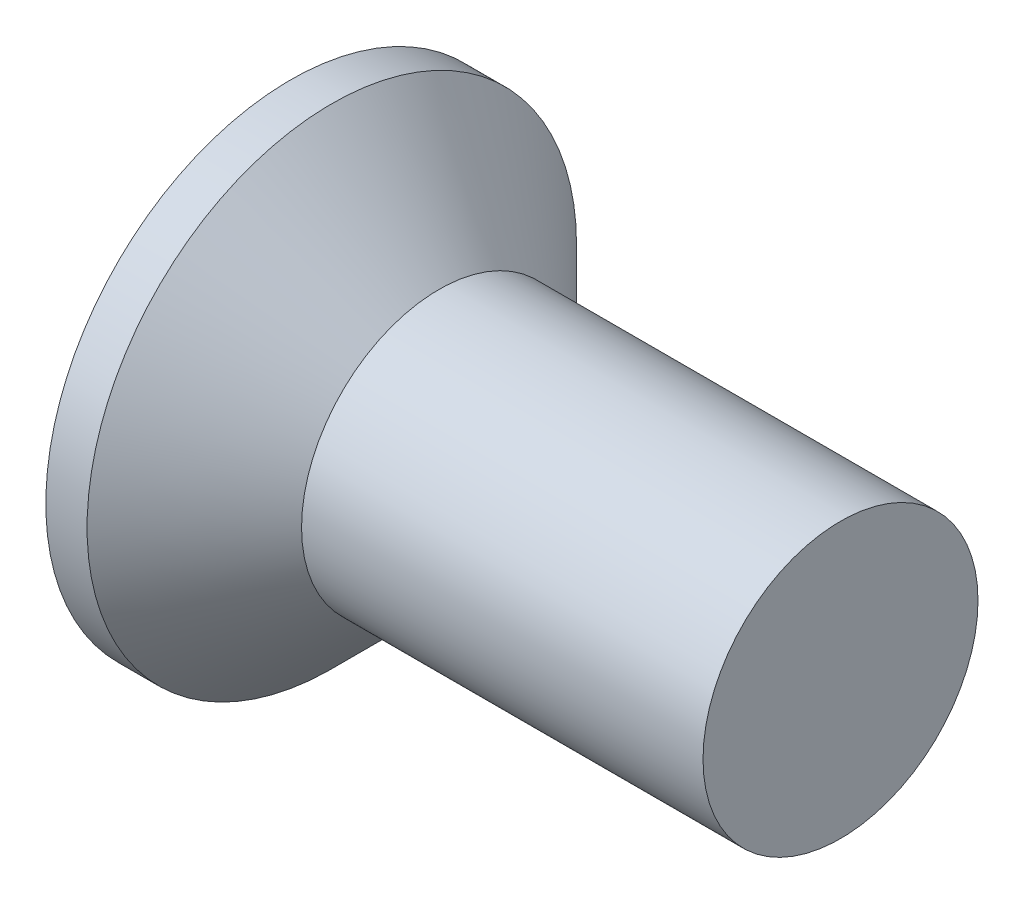
ISO-10303-21;
HEADER;
FILE_DESCRIPTION(('STEP AP214'),'2;1');
FILE_NAME('part.step','',(''),(''),'','','');
FILE_SCHEMA(('AUTOMOTIVE_DESIGN { 1 0 10303 214 1 1 1 1 }'));
ENDSEC;
DATA;
#1=APPLICATION_CONTEXT('core data for automotive mechanical design processes');
#2=APPLICATION_PROTOCOL_DEFINITION('international standard','automotive_design',2000,#1);
#3=PRODUCT_CONTEXT('',#1,'mechanical');
#4=PRODUCT('Part','Part','',(#3));
#5=PRODUCT_RELATED_PRODUCT_CATEGORY('part','',(#4));
#6=PRODUCT_DEFINITION_FORMATION('','',#4);
#7=PRODUCT_DEFINITION_CONTEXT('part definition',#1,'design');
#8=PRODUCT_DEFINITION('design','',#6,#7);
#9=PRODUCT_DEFINITION_SHAPE('','',#8);
#10=(LENGTH_UNIT() NAMED_UNIT(*) SI_UNIT(.MILLI.,.METRE.));
#11=(NAMED_UNIT(*) PLANE_ANGLE_UNIT() SI_UNIT($,.RADIAN.));
#12=(NAMED_UNIT(*) SI_UNIT($,.STERADIAN.) SOLID_ANGLE_UNIT());
#13=UNCERTAINTY_MEASURE_WITH_UNIT(LENGTH_MEASURE(1.E-05),#10,'distance_accuracy_value','');
#14=(GEOMETRIC_REPRESENTATION_CONTEXT(3) GLOBAL_UNCERTAINTY_ASSIGNED_CONTEXT((#13)) GLOBAL_UNIT_ASSIGNED_CONTEXT((#10,
#11,#12)) REPRESENTATION_CONTEXT('',''));
#15=CARTESIAN_POINT('',(0.,0.,0.));
#16=DIRECTION('',(0.,0.,1.));
#17=DIRECTION('',(1.,0.,0.));
#18=AXIS2_PLACEMENT_3D('',#15,#16,#17);
#19=CARTESIAN_POINT('',(0.,4.44999999999999,0.));
#20=DIRECTION('',(-1.,0.,0.));
#21=DIRECTION('',(0.,0.,1.));
#22=AXIS2_PLACEMENT_3D('',#19,#20,#21);
#23=PLANE('',#22);
#24=CARTESIAN_POINT('',(0.,0.,0.));
#25=DIRECTION('',(1.,0.,0.));
#26=DIRECTION('',(0.,0.,-1.));
#27=AXIS2_PLACEMENT_3D('',#24,#25,#26);
#28=CIRCLE('',#27,4.44999999999999);
#29=CARTESIAN_POINT('',(0.,0.,-4.44999999999999));
#30=VERTEX_POINT('',#29);
#31=EDGE_CURVE('E180',#30,#30,#28,.T.);
#32=ORIENTED_EDGE('',*,*,#31,.F.);
#33=EDGE_LOOP('',(#32));
#34=FACE_BOUND('',#33,.T.);
#35=DIRECTION('',(0.,1.,0.));
#36=VECTOR('',#35,1.);
#37=CARTESIAN_POINT('',(0.,-0.52,-0.52));
#38=LINE('',#37,#36);
#39=CARTESIAN_POINT('',(0.,-2.6,-0.52));
#40=VERTEX_POINT('',#39);
#41=CARTESIAN_POINT('',(0.,-0.82,-0.52));
#42=VERTEX_POINT('',#41);
#43=EDGE_CURVE('E284',#40,#42,#38,.T.);
#44=ORIENTED_EDGE('',*,*,#43,.T.);
#45=CARTESIAN_POINT('',(0.,-0.82,-0.82));
#46=DIRECTION('',(-1.,0.,0.));
#47=DIRECTION('',(0.,0.,1.));
#48=AXIS2_PLACEMENT_3D('',#45,#46,#47);
#49=CIRCLE('',#48,0.3);
#50=CARTESIAN_POINT('',(0.,-0.52,-0.82));
#51=VERTEX_POINT('',#50);
#52=EDGE_CURVE('E186',#42,#51,#49,.T.);
#53=ORIENTED_EDGE('',*,*,#52,.T.);
#54=DIRECTION('',(0.,0.,-1.));
#55=VECTOR('',#54,1.);
#56=CARTESIAN_POINT('',(0.,-0.52,-0.52));
#57=LINE('',#56,#55);
#58=CARTESIAN_POINT('',(0.,-0.52,-2.6));
#59=VERTEX_POINT('',#58);
#60=EDGE_CURVE('E279',#51,#59,#57,.T.);
#61=ORIENTED_EDGE('',*,*,#60,.T.);
#62=DIRECTION('',(0.,1.,0.));
#63=VECTOR('',#62,1.);
#64=CARTESIAN_POINT('',(0.,0.52,-2.6));
#65=LINE('',#64,#63);
#66=CARTESIAN_POINT('',(0.,0.52,-2.6));
#67=VERTEX_POINT('',#66);
#68=EDGE_CURVE('E243',#59,#67,#65,.T.);
#69=ORIENTED_EDGE('',*,*,#68,.T.);
#70=DIRECTION('',(0.,0.,1.));
#71=VECTOR('',#70,1.);
#72=CARTESIAN_POINT('',(0.,0.52,-0.52));
#73=LINE('',#72,#71);
#74=CARTESIAN_POINT('',(0.,0.52,-0.82));
#75=VERTEX_POINT('',#74);
#76=EDGE_CURVE('E233',#67,#75,#73,.T.);
#77=ORIENTED_EDGE('',*,*,#76,.T.);
#78=CARTESIAN_POINT('',(0.,0.82,-0.82));
#79=DIRECTION('',(-1.,0.,0.));
#80=DIRECTION('',(0.,0.,1.));
#81=AXIS2_PLACEMENT_3D('',#78,#79,#80);
#82=CIRCLE('',#81,0.3);
#83=CARTESIAN_POINT('',(0.,0.82,-0.52));
#84=VERTEX_POINT('',#83);
#85=EDGE_CURVE('E182',#75,#84,#82,.T.);
#86=ORIENTED_EDGE('',*,*,#85,.T.);
#87=DIRECTION('',(0.,1.,0.));
#88=VECTOR('',#87,1.);
#89=CARTESIAN_POINT('',(0.,0.52,-0.52));
#90=LINE('',#89,#88);
#91=CARTESIAN_POINT('',(0.,2.6,-0.52));
#92=VERTEX_POINT('',#91);
#93=EDGE_CURVE('E230',#84,#92,#90,.T.);
#94=ORIENTED_EDGE('',*,*,#93,.T.);
#95=DIRECTION('',(0.,0.,1.));
#96=VECTOR('',#95,1.);
#97=CARTESIAN_POINT('',(0.,2.6,-0.52));
#98=LINE('',#97,#96);
#99=CARTESIAN_POINT('',(0.,2.6,0.52));
#100=VERTEX_POINT('',#99);
#101=EDGE_CURVE('E239',#92,#100,#98,.T.);
#102=ORIENTED_EDGE('',*,*,#101,.T.);
#103=DIRECTION('',(0.,-1.,0.));
#104=VECTOR('',#103,1.);
#105=CARTESIAN_POINT('',(0.,0.52,0.52));
#106=LINE('',#105,#104);
#107=CARTESIAN_POINT('',(0.,0.82,0.52));
#108=VERTEX_POINT('',#107);
#109=EDGE_CURVE('E241',#100,#108,#106,.T.);
#110=ORIENTED_EDGE('',*,*,#109,.T.);
#111=CARTESIAN_POINT('',(0.,0.82,0.82));
#112=DIRECTION('',(-1.,0.,0.));
#113=DIRECTION('',(0.,0.,1.));
#114=AXIS2_PLACEMENT_3D('',#111,#112,#113);
#115=CIRCLE('',#114,0.3);
#116=CARTESIAN_POINT('',(0.,0.52,0.82));
#117=VERTEX_POINT('',#116);
#118=EDGE_CURVE('E152',#108,#117,#115,.T.);
#119=ORIENTED_EDGE('',*,*,#118,.T.);
#120=DIRECTION('',(0.,0.,1.));
#121=VECTOR('',#120,1.);
#122=CARTESIAN_POINT('',(0.,0.52,0.52));
#123=LINE('',#122,#121);
#124=CARTESIAN_POINT('',(0.,0.519999999999999,2.6));
#125=VERTEX_POINT('',#124);
#126=EDGE_CURVE('E146',#117,#125,#123,.T.);
#127=ORIENTED_EDGE('',*,*,#126,.T.);
#128=DIRECTION('',(0.,-1.,0.));
#129=VECTOR('',#128,1.);
#130=CARTESIAN_POINT('',(0.,0.519999999999999,2.6));
#131=LINE('',#130,#129);
#132=CARTESIAN_POINT('',(0.,-0.520000000000001,2.6));
#133=VERTEX_POINT('',#132);
#134=EDGE_CURVE('E150',#125,#133,#131,.T.);
#135=ORIENTED_EDGE('',*,*,#134,.T.);
#136=DIRECTION('',(0.,0.,-1.));
#137=VECTOR('',#136,1.);
#138=CARTESIAN_POINT('',(0.,-0.52,0.519999999999999));
#139=LINE('',#138,#137);
#140=CARTESIAN_POINT('',(0.,-0.52,0.819999999999999));
#141=VERTEX_POINT('',#140);
#142=EDGE_CURVE('E162',#133,#141,#139,.T.);
#143=ORIENTED_EDGE('',*,*,#142,.T.);
#144=CARTESIAN_POINT('',(0.,-0.82,0.819999999999999));
#145=DIRECTION('',(-1.,0.,0.));
#146=DIRECTION('',(0.,0.,1.));
#147=AXIS2_PLACEMENT_3D('',#144,#145,#146);
#148=CIRCLE('',#147,0.3);
#149=CARTESIAN_POINT('',(0.,-0.82,0.519999999999999));
#150=VERTEX_POINT('',#149);
#151=EDGE_CURVE('E184',#141,#150,#148,.T.);
#152=ORIENTED_EDGE('',*,*,#151,.T.);
#153=DIRECTION('',(0.,-1.,0.));
#154=VECTOR('',#153,1.);
#155=CARTESIAN_POINT('',(0.,-0.52,0.519999999999999));
#156=LINE('',#155,#154);
#157=CARTESIAN_POINT('',(0.,-2.6,0.519999999999999));
#158=VERTEX_POINT('',#157);
#159=EDGE_CURVE('E291',#150,#158,#156,.T.);
#160=ORIENTED_EDGE('',*,*,#159,.T.);
#161=DIRECTION('',(0.,0.,-1.));
#162=VECTOR('',#161,1.);
#163=CARTESIAN_POINT('',(0.,-2.6,-0.52));
#164=LINE('',#163,#162);
#165=EDGE_CURVE('E288',#158,#40,#164,.T.);
#166=ORIENTED_EDGE('',*,*,#165,.T.);
#167=EDGE_LOOP('',(#44,#53,#61,#69,#77,#86,#94,#102,#110,#119,#127,#135,#143,#152,#160,#166));
#168=FACE_BOUND('',#167,.T.);
#169=ADVANCED_FACE('F34',(#34,#168),#23,.T.);
#170=CARTESIAN_POINT('',(10.,2.49999999999999,0.));
#171=DIRECTION('',(1.,0.,0.));
#172=DIRECTION('',(0.,0.,-1.));
#173=AXIS2_PLACEMENT_3D('',#170,#171,#172);
#174=PLANE('',#173);
#175=CARTESIAN_POINT('',(9.99999999999999,0.,0.));
#176=DIRECTION('',(1.,0.,0.));
#177=DIRECTION('',(0.,0.,-1.));
#178=AXIS2_PLACEMENT_3D('',#175,#176,#177);
#179=CIRCLE('',#178,2.49999999999999);
#180=CARTESIAN_POINT('',(9.99999999999999,0.,-2.49999999999999));
#181=VERTEX_POINT('',#180);
#182=EDGE_CURVE('E167',#181,#181,#179,.T.);
#183=ORIENTED_EDGE('',*,*,#182,.T.);
#184=EDGE_LOOP('',(#183));
#185=FACE_BOUND('',#184,.T.);
#186=ADVANCED_FACE('F340',(#185),#174,.T.);
#187=CARTESIAN_POINT('',(4.51581291088132,0.,0.));
#188=DIRECTION('',(1.,0.,0.));
#189=DIRECTION('',(0.,0.,-1.));
#190=AXIS2_PLACEMENT_3D('',#187,#188,#189);
#191=CYLINDRICAL_SURFACE('',#190,4.44999999999999);
#192=ORIENTED_EDGE('',*,*,#31,.T.);
#193=EDGE_LOOP('',(#192));
#194=FACE_BOUND('',#193,.T.);
#195=CARTESIAN_POINT('',(0.750000000000007,0.,0.));
#196=DIRECTION('',(1.,0.,0.));
#197=DIRECTION('',(0.,0.,-1.));
#198=AXIS2_PLACEMENT_3D('',#195,#196,#197);
#199=CIRCLE('',#198,4.44999999999999);
#200=CARTESIAN_POINT('',(0.750000000000007,0.,-4.44999999999999));
#201=VERTEX_POINT('',#200);
#202=EDGE_CURVE('E250',#201,#201,#199,.T.);
#203=ORIENTED_EDGE('',*,*,#202,.F.);
#204=EDGE_LOOP('',(#203));
#205=FACE_BOUND('',#204,.T.);
#206=ADVANCED_FACE('F346',(#194,#205),#191,.T.);
#207=CARTESIAN_POINT('',(2.7,0.,0.));
#208=DIRECTION('',(-1.,0.,0.));
#209=DIRECTION('',(0.,0.,1.));
#210=AXIS2_PLACEMENT_3D('',#207,#208,#209);
#211=CONICAL_SURFACE('',#210,2.49999999999999,0.78539816339745);
#212=ORIENTED_EDGE('',*,*,#202,.T.);
#213=EDGE_LOOP('',(#212));
#214=FACE_BOUND('',#213,.T.);
#215=CARTESIAN_POINT('',(2.7,0.,0.));
#216=DIRECTION('',(1.,0.,0.));
#217=DIRECTION('',(0.,0.,-1.));
#218=AXIS2_PLACEMENT_3D('',#215,#216,#217);
#219=CIRCLE('',#218,2.49999999999999);
#220=CARTESIAN_POINT('',(2.7,0.,-2.49999999999999));
#221=VERTEX_POINT('',#220);
#222=EDGE_CURVE('E170',#221,#221,#219,.T.);
#223=ORIENTED_EDGE('',*,*,#222,.F.);
#224=EDGE_LOOP('',(#223));
#225=FACE_BOUND('',#224,.T.);
#226=ADVANCED_FACE('F486',(#214,#225),#211,.T.);
#227=CARTESIAN_POINT('',(4.51581291088132,0.,0.));
#228=DIRECTION('',(1.,0.,0.));
#229=DIRECTION('',(0.,0.,-1.));
#230=AXIS2_PLACEMENT_3D('',#227,#228,#229);
#231=CYLINDRICAL_SURFACE('',#230,2.49999999999999);
#232=ORIENTED_EDGE('',*,*,#182,.F.);
#233=EDGE_LOOP('',(#232));
#234=FACE_BOUND('',#233,.T.);
#235=ORIENTED_EDGE('',*,*,#222,.T.);
#236=EDGE_LOOP('',(#235));
#237=FACE_BOUND('',#236,.T.);
#238=ADVANCED_FACE('F456',(#234,#237),#231,.T.);
#239=CARTESIAN_POINT('',(1.35,0.52,0.52));
#240=DIRECTION('',(0.,-1.,0.));
#241=DIRECTION('',(0.,0.,-1.));
#242=AXIS2_PLACEMENT_3D('',#239,#240,#241);
#243=PLANE('',#242);
#244=ORIENTED_EDGE('',*,*,#126,.F.);
#245=DIRECTION('',(-1.,0.,0.));
#246=VECTOR('',#245,1.);
#247=CARTESIAN_POINT('',(1.35,0.52,0.82));
#248=LINE('',#247,#246);
#249=CARTESIAN_POINT('',(1.35,0.52,0.82));
#250=VERTEX_POINT('',#249);
#251=EDGE_CURVE('E49',#117,#250,#248,.F.);
#252=ORIENTED_EDGE('',*,*,#251,.T.);
#253=DIRECTION('',(0.,0.,1.));
#254=VECTOR('',#253,1.);
#255=CARTESIAN_POINT('',(1.35,0.52,0.52));
#256=LINE('',#255,#254);
#257=CARTESIAN_POINT('',(1.35,0.52,1.820577136594));
#258=VERTEX_POINT('',#257);
#259=EDGE_CURVE('E165',#250,#258,#256,.T.);
#260=ORIENTED_EDGE('',*,*,#259,.T.);
#261=DIRECTION('',(-0.866025403784438,0.,0.500000000000001));
#262=VECTOR('',#261,1.);
#263=CARTESIAN_POINT('',(0.,0.519999999999999,2.6));
#264=LINE('',#263,#262);
#265=EDGE_CURVE('E158',#258,#125,#264,.T.);
#266=ORIENTED_EDGE('',*,*,#265,.T.);
#267=EDGE_LOOP('',(#244,#252,#260,#266));
#268=FACE_BOUND('',#267,.T.);
#269=ADVANCED_FACE('F164',(#268),#243,.T.);
#270=CARTESIAN_POINT('',(0.,0.519999999999999,2.6));
#271=DIRECTION('',(-0.500000000000001,0.,-0.866025403784438));
#272=DIRECTION('',(-0.866025403784438,0.,0.500000000000001));
#273=AXIS2_PLACEMENT_3D('',#270,#271,#272);
#274=PLANE('',#273);
#275=ORIENTED_EDGE('',*,*,#134,.F.);
#276=ORIENTED_EDGE('',*,*,#265,.F.);
#277=DIRECTION('',(0.,-1.,0.));
#278=VECTOR('',#277,1.);
#279=CARTESIAN_POINT('',(1.35,0.52,1.820577136594));
#280=LINE('',#279,#278);
#281=CARTESIAN_POINT('',(1.35,-0.52,1.820577136594));
#282=VERTEX_POINT('',#281);
#283=EDGE_CURVE('E176',#258,#282,#280,.T.);
#284=ORIENTED_EDGE('',*,*,#283,.T.);
#285=DIRECTION('',(-0.866025403784438,0.,0.500000000000001));
#286=VECTOR('',#285,1.);
#287=CARTESIAN_POINT('',(1.91316641993582,-0.52,1.4954328524455));
#288=LINE('',#287,#286);
#289=EDGE_CURVE('E160',#282,#133,#288,.T.);
#290=ORIENTED_EDGE('',*,*,#289,.T.);
#291=EDGE_LOOP('',(#275,#276,#284,#290));
#292=FACE_BOUND('',#291,.T.);
#293=ADVANCED_FACE('F157',(#292),#274,.T.);
#294=CARTESIAN_POINT('',(1.35,-0.52,0.519999999999999));
#295=DIRECTION('',(0.,1.,0.));
#296=DIRECTION('',(0.,0.,1.));
#297=AXIS2_PLACEMENT_3D('',#294,#295,#296);
#298=PLANE('',#297);
#299=DIRECTION('',(0.,0.,-1.));
#300=VECTOR('',#299,1.);
#301=CARTESIAN_POINT('',(1.35,-0.52,0.519999999999999));
#302=LINE('',#301,#300);
#303=CARTESIAN_POINT('',(1.35,-0.52,0.819999999999999));
#304=VERTEX_POINT('',#303);
#305=EDGE_CURVE('E300',#282,#304,#302,.T.);
#306=ORIENTED_EDGE('',*,*,#305,.T.);
#307=DIRECTION('',(-1.,0.,0.));
#308=VECTOR('',#307,1.);
#309=CARTESIAN_POINT('',(1.35,-0.52,0.819999999999999));
#310=LINE('',#309,#308);
#311=EDGE_CURVE('E190',#304,#141,#310,.T.);
#312=ORIENTED_EDGE('',*,*,#311,.T.);
#313=ORIENTED_EDGE('',*,*,#142,.F.);
#314=ORIENTED_EDGE('',*,*,#289,.F.);
#315=EDGE_LOOP('',(#306,#312,#313,#314));
#316=FACE_BOUND('',#315,.T.);
#317=ADVANCED_FACE('F305',(#316),#298,.T.);
#318=CARTESIAN_POINT('',(1.35,-0.52,0.519999999999999));
#319=DIRECTION('',(0.,0.,-1.));
#320=DIRECTION('',(0.,1.,0.));
#321=AXIS2_PLACEMENT_3D('',#318,#319,#320);
#322=PLANE('',#321);
#323=ORIENTED_EDGE('',*,*,#159,.F.);
#324=DIRECTION('',(-1.,0.,0.));
#325=VECTOR('',#324,1.);
#326=CARTESIAN_POINT('',(1.35,-0.82,0.519999999999999));
#327=LINE('',#326,#325);
#328=CARTESIAN_POINT('',(1.35,-0.82,0.519999999999999));
#329=VERTEX_POINT('',#328);
#330=EDGE_CURVE('E193',#150,#329,#327,.F.);
#331=ORIENTED_EDGE('',*,*,#330,.T.);
#332=DIRECTION('',(0.,-1.,0.));
#333=VECTOR('',#332,1.);
#334=CARTESIAN_POINT('',(1.35,-0.52,0.519999999999999));
#335=LINE('',#334,#333);
#336=CARTESIAN_POINT('',(1.35,-1.820577136594,0.519999999999999));
#337=VERTEX_POINT('',#336);
#338=EDGE_CURVE('E261',#329,#337,#335,.T.);
#339=ORIENTED_EDGE('',*,*,#338,.T.);
#340=DIRECTION('',(-0.866025403784438,-0.500000000000001,0.));
#341=VECTOR('',#340,1.);
#342=CARTESIAN_POINT('',(0.,-2.6,0.519999999999999));
#343=LINE('',#342,#341);
#344=EDGE_CURVE('E172',#337,#158,#343,.T.);
#345=ORIENTED_EDGE('',*,*,#344,.T.);
#346=EDGE_LOOP('',(#323,#331,#339,#345));
#347=FACE_BOUND('',#346,.T.);
#348=ADVANCED_FACE('F315',(#347),#322,.T.);
#349=CARTESIAN_POINT('',(0.,-2.6,-0.52));
#350=DIRECTION('',(-0.500000000000001,0.866025403784438,0.));
#351=DIRECTION('',(-0.866025403784438,-0.500000000000001,0.));
#352=AXIS2_PLACEMENT_3D('',#349,#350,#351);
#353=PLANE('',#352);
#354=ORIENTED_EDGE('',*,*,#165,.F.);
#355=ORIENTED_EDGE('',*,*,#344,.F.);
#356=DIRECTION('',(0.,0.,-1.));
#357=VECTOR('',#356,1.);
#358=CARTESIAN_POINT('',(1.35,-1.820577136594,-0.52));
#359=LINE('',#358,#357);
#360=CARTESIAN_POINT('',(1.35,-1.820577136594,-0.52));
#361=VERTEX_POINT('',#360);
#362=EDGE_CURVE('E258',#337,#361,#359,.T.);
#363=ORIENTED_EDGE('',*,*,#362,.T.);
#364=DIRECTION('',(-0.866025403784438,-0.500000000000001,0.));
#365=VECTOR('',#364,1.);
#366=CARTESIAN_POINT('',(1.91316641993582,-1.4954328524455,-0.52));
#367=LINE('',#366,#365);
#368=EDGE_CURVE('E255',#361,#40,#367,.T.);
#369=ORIENTED_EDGE('',*,*,#368,.T.);
#370=EDGE_LOOP('',(#354,#355,#363,#369));
#371=FACE_BOUND('',#370,.T.);
#372=ADVANCED_FACE('F319',(#371),#353,.T.);
#373=CARTESIAN_POINT('',(1.35,-0.52,-0.52));
#374=DIRECTION('',(0.,0.,1.));
#375=DIRECTION('',(0.,-1.,0.));
#376=AXIS2_PLACEMENT_3D('',#373,#374,#375);
#377=PLANE('',#376);
#378=DIRECTION('',(0.,1.,0.));
#379=VECTOR('',#378,1.);
#380=CARTESIAN_POINT('',(1.35,-0.52,-0.52));
#381=LINE('',#380,#379);
#382=CARTESIAN_POINT('',(1.35,-0.82,-0.52));
#383=VERTEX_POINT('',#382);
#384=EDGE_CURVE('E260',#361,#383,#381,.T.);
#385=ORIENTED_EDGE('',*,*,#384,.T.);
#386=DIRECTION('',(-1.,0.,0.));
#387=VECTOR('',#386,1.);
#388=CARTESIAN_POINT('',(1.35,-0.82,-0.52));
#389=LINE('',#388,#387);
#390=EDGE_CURVE('E177',#383,#42,#389,.T.);
#391=ORIENTED_EDGE('',*,*,#390,.T.);
#392=ORIENTED_EDGE('',*,*,#43,.F.);
#393=ORIENTED_EDGE('',*,*,#368,.F.);
#394=EDGE_LOOP('',(#385,#391,#392,#393));
#395=FACE_BOUND('',#394,.T.);
#396=ADVANCED_FACE('F323',(#395),#377,.T.);
#397=CARTESIAN_POINT('',(1.35,-0.52,-0.52));
#398=DIRECTION('',(0.,1.,0.));
#399=DIRECTION('',(0.,0.,1.));
#400=AXIS2_PLACEMENT_3D('',#397,#398,#399);
#401=PLANE('',#400);
#402=ORIENTED_EDGE('',*,*,#60,.F.);
#403=DIRECTION('',(-1.,0.,0.));
#404=VECTOR('',#403,1.);
#405=CARTESIAN_POINT('',(1.35,-0.52,-0.82));
#406=LINE('',#405,#404);
#407=CARTESIAN_POINT('',(1.35,-0.52,-0.82));
#408=VERTEX_POINT('',#407);
#409=EDGE_CURVE('E188',#51,#408,#406,.F.);
#410=ORIENTED_EDGE('',*,*,#409,.T.);
#411=DIRECTION('',(0.,0.,-1.));
#412=VECTOR('',#411,1.);
#413=CARTESIAN_POINT('',(1.35,-0.52,-0.52));
#414=LINE('',#413,#412);
#415=CARTESIAN_POINT('',(1.35,-0.52,-1.820577136594));
#416=VERTEX_POINT('',#415);
#417=EDGE_CURVE('E272',#408,#416,#414,.T.);
#418=ORIENTED_EDGE('',*,*,#417,.T.);
#419=DIRECTION('',(-0.866025403784438,0.,-0.500000000000001));
#420=VECTOR('',#419,1.);
#421=CARTESIAN_POINT('',(0.,-0.52,-2.6));
#422=LINE('',#421,#420);
#423=EDGE_CURVE('E257',#416,#59,#422,.T.);
#424=ORIENTED_EDGE('',*,*,#423,.T.);
#425=EDGE_LOOP('',(#402,#410,#418,#424));
#426=FACE_BOUND('',#425,.T.);
#427=ADVANCED_FACE('F278',(#426),#401,.T.);
#428=CARTESIAN_POINT('',(0.,0.52,-2.6));
#429=DIRECTION('',(-0.500000000000001,0.,0.866025403784438));
#430=DIRECTION('',(0.866025403784438,0.,0.500000000000001));
#431=AXIS2_PLACEMENT_3D('',#428,#429,#430);
#432=PLANE('',#431);
#433=ORIENTED_EDGE('',*,*,#68,.F.);
#434=ORIENTED_EDGE('',*,*,#423,.F.);
#435=DIRECTION('',(0.,1.,0.));
#436=VECTOR('',#435,1.);
#437=CARTESIAN_POINT('',(1.35,0.52,-1.820577136594));
#438=LINE('',#437,#436);
#439=CARTESIAN_POINT('',(1.35,0.52,-1.820577136594));
#440=VERTEX_POINT('',#439);
#441=EDGE_CURVE('E225',#416,#440,#438,.T.);
#442=ORIENTED_EDGE('',*,*,#441,.T.);
#443=DIRECTION('',(-0.866025403784438,0.,-0.500000000000001));
#444=VECTOR('',#443,1.);
#445=CARTESIAN_POINT('',(1.91316641993582,0.52,-1.4954328524455));
#446=LINE('',#445,#444);
#447=EDGE_CURVE('E224',#440,#67,#446,.T.);
#448=ORIENTED_EDGE('',*,*,#447,.T.);
#449=EDGE_LOOP('',(#433,#434,#442,#448));
#450=FACE_BOUND('',#449,.T.);
#451=ADVANCED_FACE('F283',(#450),#432,.T.);
#452=CARTESIAN_POINT('',(1.35,0.52,-0.52));
#453=DIRECTION('',(0.,-1.,0.));
#454=DIRECTION('',(0.,0.,-1.));
#455=AXIS2_PLACEMENT_3D('',#452,#453,#454);
#456=PLANE('',#455);
#457=DIRECTION('',(0.,0.,1.));
#458=VECTOR('',#457,1.);
#459=CARTESIAN_POINT('',(1.35,0.52,-0.52));
#460=LINE('',#459,#458);
#461=CARTESIAN_POINT('',(1.35,0.52,-0.82));
#462=VERTEX_POINT('',#461);
#463=EDGE_CURVE('E213',#440,#462,#460,.T.);
#464=ORIENTED_EDGE('',*,*,#463,.T.);
#465=DIRECTION('',(-1.,0.,0.));
#466=VECTOR('',#465,1.);
#467=CARTESIAN_POINT('',(1.35,0.52,-0.82));
#468=LINE('',#467,#466);
#469=EDGE_CURVE('E195',#462,#75,#468,.T.);
#470=ORIENTED_EDGE('',*,*,#469,.T.);
#471=ORIENTED_EDGE('',*,*,#76,.F.);
#472=ORIENTED_EDGE('',*,*,#447,.F.);
#473=EDGE_LOOP('',(#464,#470,#471,#472));
#474=FACE_BOUND('',#473,.T.);
#475=ADVANCED_FACE('F221',(#474),#456,.T.);
#476=CARTESIAN_POINT('',(1.35,0.52,-0.52));
#477=DIRECTION('',(0.,0.,1.));
#478=DIRECTION('',(0.,-1.,0.));
#479=AXIS2_PLACEMENT_3D('',#476,#477,#478);
#480=PLANE('',#479);
#481=ORIENTED_EDGE('',*,*,#93,.F.);
#482=DIRECTION('',(-1.,0.,0.));
#483=VECTOR('',#482,1.);
#484=CARTESIAN_POINT('',(1.35,0.82,-0.52));
#485=LINE('',#484,#483);
#486=CARTESIAN_POINT('',(1.35,0.82,-0.52));
#487=VERTEX_POINT('',#486);
#488=EDGE_CURVE('E198',#84,#487,#485,.F.);
#489=ORIENTED_EDGE('',*,*,#488,.T.);
#490=DIRECTION('',(0.,1.,0.));
#491=VECTOR('',#490,1.);
#492=CARTESIAN_POINT('',(1.35,0.52,-0.52));
#493=LINE('',#492,#491);
#494=CARTESIAN_POINT('',(1.35,1.820577136594,-0.52));
#495=VERTEX_POINT('',#494);
#496=EDGE_CURVE('E215',#487,#495,#493,.T.);
#497=ORIENTED_EDGE('',*,*,#496,.T.);
#498=DIRECTION('',(-0.866025403784438,0.500000000000001,0.));
#499=VECTOR('',#498,1.);
#500=CARTESIAN_POINT('',(0.,2.6,-0.52));
#501=LINE('',#500,#499);
#502=EDGE_CURVE('E237',#495,#92,#501,.T.);
#503=ORIENTED_EDGE('',*,*,#502,.T.);
#504=EDGE_LOOP('',(#481,#489,#497,#503));
#505=FACE_BOUND('',#504,.T.);
#506=ADVANCED_FACE('F235',(#505),#480,.T.);
#507=CARTESIAN_POINT('',(0.,2.6,-0.52));
#508=DIRECTION('',(-0.500000000000001,-0.866025403784438,0.));
#509=DIRECTION('',(0.866025403784438,-0.500000000000001,0.));
#510=AXIS2_PLACEMENT_3D('',#507,#508,#509);
#511=PLANE('',#510);
#512=ORIENTED_EDGE('',*,*,#101,.F.);
#513=ORIENTED_EDGE('',*,*,#502,.F.);
#514=DIRECTION('',(0.,0.,1.));
#515=VECTOR('',#514,1.);
#516=CARTESIAN_POINT('',(1.35,1.820577136594,-0.52));
#517=LINE('',#516,#515);
#518=CARTESIAN_POINT('',(1.35,1.820577136594,0.52));
#519=VERTEX_POINT('',#518);
#520=EDGE_CURVE('E267',#495,#519,#517,.T.);
#521=ORIENTED_EDGE('',*,*,#520,.T.);
#522=DIRECTION('',(-0.866025403784438,0.500000000000001,0.));
#523=VECTOR('',#522,1.);
#524=CARTESIAN_POINT('',(1.91316641993582,1.4954328524455,0.52));
#525=LINE('',#524,#523);
#526=EDGE_CURVE('E264',#519,#100,#525,.T.);
#527=ORIENTED_EDGE('',*,*,#526,.T.);
#528=EDGE_LOOP('',(#512,#513,#521,#527));
#529=FACE_BOUND('',#528,.T.);
#530=ADVANCED_FACE('F358',(#529),#511,.T.);
#531=CARTESIAN_POINT('',(1.35,0.52,0.52));
#532=DIRECTION('',(0.,0.,-1.));
#533=DIRECTION('',(0.,1.,0.));
#534=AXIS2_PLACEMENT_3D('',#531,#532,#533);
#535=PLANE('',#534);
#536=DIRECTION('',(0.,-1.,0.));
#537=VECTOR('',#536,1.);
#538=CARTESIAN_POINT('',(1.35,0.52,0.52));
#539=LINE('',#538,#537);
#540=CARTESIAN_POINT('',(1.35,0.82,0.52));
#541=VERTEX_POINT('',#540);
#542=EDGE_CURVE('E266',#519,#541,#539,.T.);
#543=ORIENTED_EDGE('',*,*,#542,.T.);
#544=DIRECTION('',(-1.,0.,0.));
#545=VECTOR('',#544,1.);
#546=CARTESIAN_POINT('',(1.35,0.82,0.52));
#547=LINE('',#546,#545);
#548=EDGE_CURVE('E200',#541,#108,#547,.T.);
#549=ORIENTED_EDGE('',*,*,#548,.T.);
#550=ORIENTED_EDGE('',*,*,#109,.F.);
#551=ORIENTED_EDGE('',*,*,#526,.F.);
#552=EDGE_LOOP('',(#543,#549,#550,#551));
#553=FACE_BOUND('',#552,.T.);
#554=ADVANCED_FACE('F336',(#553),#535,.T.);
#555=CARTESIAN_POINT('',(1.35,0.52,0.52));
#556=DIRECTION('',(1.,0.,0.));
#557=DIRECTION('',(0.,0.,-1.));
#558=AXIS2_PLACEMENT_3D('',#555,#556,#557);
#559=PLANE('',#558);
#560=ORIENTED_EDGE('',*,*,#259,.F.);
#561=CARTESIAN_POINT('',(1.35,0.82,0.82));
#562=DIRECTION('',(1.,0.,0.));
#563=DIRECTION('',(0.,0.,-1.));
#564=AXIS2_PLACEMENT_3D('',#561,#562,#563);
#565=CIRCLE('',#564,0.3);
#566=EDGE_CURVE('E11',#250,#541,#565,.T.);
#567=ORIENTED_EDGE('',*,*,#566,.T.);
#568=ORIENTED_EDGE('',*,*,#542,.F.);
#569=ORIENTED_EDGE('',*,*,#520,.F.);
#570=ORIENTED_EDGE('',*,*,#496,.F.);
#571=CARTESIAN_POINT('',(1.35,0.82,-0.82));
#572=DIRECTION('',(1.,0.,0.));
#573=DIRECTION('',(0.,0.,-1.));
#574=AXIS2_PLACEMENT_3D('',#571,#572,#573);
#575=CIRCLE('',#574,0.3);
#576=EDGE_CURVE('E42',#487,#462,#575,.T.);
#577=ORIENTED_EDGE('',*,*,#576,.T.);
#578=ORIENTED_EDGE('',*,*,#463,.F.);
#579=ORIENTED_EDGE('',*,*,#441,.F.);
#580=ORIENTED_EDGE('',*,*,#417,.F.);
#581=CARTESIAN_POINT('',(1.35,-0.82,-0.82));
#582=DIRECTION('',(1.,0.,0.));
#583=DIRECTION('',(0.,0.,-1.));
#584=AXIS2_PLACEMENT_3D('',#581,#582,#583);
#585=CIRCLE('',#584,0.3);
#586=EDGE_CURVE('E204',#408,#383,#585,.T.);
#587=ORIENTED_EDGE('',*,*,#586,.T.);
#588=ORIENTED_EDGE('',*,*,#384,.F.);
#589=ORIENTED_EDGE('',*,*,#362,.F.);
#590=ORIENTED_EDGE('',*,*,#338,.F.);
#591=CARTESIAN_POINT('',(1.35,-0.82,0.819999999999999));
#592=DIRECTION('',(1.,0.,0.));
#593=DIRECTION('',(0.,0.,-1.));
#594=AXIS2_PLACEMENT_3D('',#591,#592,#593);
#595=CIRCLE('',#594,0.3);
#596=EDGE_CURVE('E206',#329,#304,#595,.T.);
#597=ORIENTED_EDGE('',*,*,#596,.T.);
#598=ORIENTED_EDGE('',*,*,#305,.F.);
#599=ORIENTED_EDGE('',*,*,#283,.F.);
#600=EDGE_LOOP('',(#560,#567,#568,#569,#570,#577,#578,#579,#580,#587,#588,#589,#590,#597,#598,#599));
#601=FACE_BOUND('',#600,.T.);
#602=ADVANCED_FACE('F211',(#601),#559,.F.);
#603=CARTESIAN_POINT('',(1.35,-0.82,-0.82));
#604=DIRECTION('',(-1.,0.,0.));
#605=DIRECTION('',(0.,0.,1.));
#606=AXIS2_PLACEMENT_3D('',#603,#604,#605);
#607=CYLINDRICAL_SURFACE('',#606,0.3);
#608=ORIENTED_EDGE('',*,*,#586,.F.);
#609=ORIENTED_EDGE('',*,*,#409,.F.);
#610=ORIENTED_EDGE('',*,*,#52,.F.);
#611=ORIENTED_EDGE('',*,*,#390,.F.);
#612=EDGE_LOOP('',(#608,#609,#610,#611));
#613=FACE_BOUND('',#612,.T.);
#614=ADVANCED_FACE('F328',(#613),#607,.T.);
#615=CARTESIAN_POINT('',(1.35,-0.82,0.819999999999999));
#616=DIRECTION('',(-1.,0.,0.));
#617=DIRECTION('',(0.,0.,1.));
#618=AXIS2_PLACEMENT_3D('',#615,#616,#617);
#619=CYLINDRICAL_SURFACE('',#618,0.3);
#620=ORIENTED_EDGE('',*,*,#596,.F.);
#621=ORIENTED_EDGE('',*,*,#330,.F.);
#622=ORIENTED_EDGE('',*,*,#151,.F.);
#623=ORIENTED_EDGE('',*,*,#311,.F.);
#624=EDGE_LOOP('',(#620,#621,#622,#623));
#625=FACE_BOUND('',#624,.T.);
#626=ADVANCED_FACE('F312',(#625),#619,.T.);
#627=CARTESIAN_POINT('',(1.35,0.82,-0.82));
#628=DIRECTION('',(-1.,0.,0.));
#629=DIRECTION('',(0.,0.,1.));
#630=AXIS2_PLACEMENT_3D('',#627,#628,#629);
#631=CYLINDRICAL_SURFACE('',#630,0.3);
#632=ORIENTED_EDGE('',*,*,#576,.F.);
#633=ORIENTED_EDGE('',*,*,#488,.F.);
#634=ORIENTED_EDGE('',*,*,#85,.F.);
#635=ORIENTED_EDGE('',*,*,#469,.F.);
#636=EDGE_LOOP('',(#632,#633,#634,#635));
#637=FACE_BOUND('',#636,.T.);
#638=ADVANCED_FACE('F227',(#637),#631,.T.);
#639=CARTESIAN_POINT('',(1.35,0.82,0.82));
#640=DIRECTION('',(-1.,0.,0.));
#641=DIRECTION('',(0.,0.,1.));
#642=AXIS2_PLACEMENT_3D('',#639,#640,#641);
#643=CYLINDRICAL_SURFACE('',#642,0.3);
#644=ORIENTED_EDGE('',*,*,#566,.F.);
#645=ORIENTED_EDGE('',*,*,#251,.F.);
#646=ORIENTED_EDGE('',*,*,#118,.F.);
#647=ORIENTED_EDGE('',*,*,#548,.F.);
#648=EDGE_LOOP('',(#644,#645,#646,#647));
#649=FACE_BOUND('',#648,.T.);
#650=ADVANCED_FACE('F36',(#649),#643,.T.);
#651=CLOSED_SHELL('',(#169,#186,#206,#226,#238,#269,#293,#317,#348,#372,#396,#427,#451,#475,
#506,#530,#554,#602,#614,#626,#638,#650));
#652=MANIFOLD_SOLID_BREP('B2',#651);
#653=ADVANCED_BREP_SHAPE_REPRESENTATION('',(#18,#652),#14);
#654=SHAPE_DEFINITION_REPRESENTATION(#9,#653);
ENDSEC;
END-ISO-10303-21;
